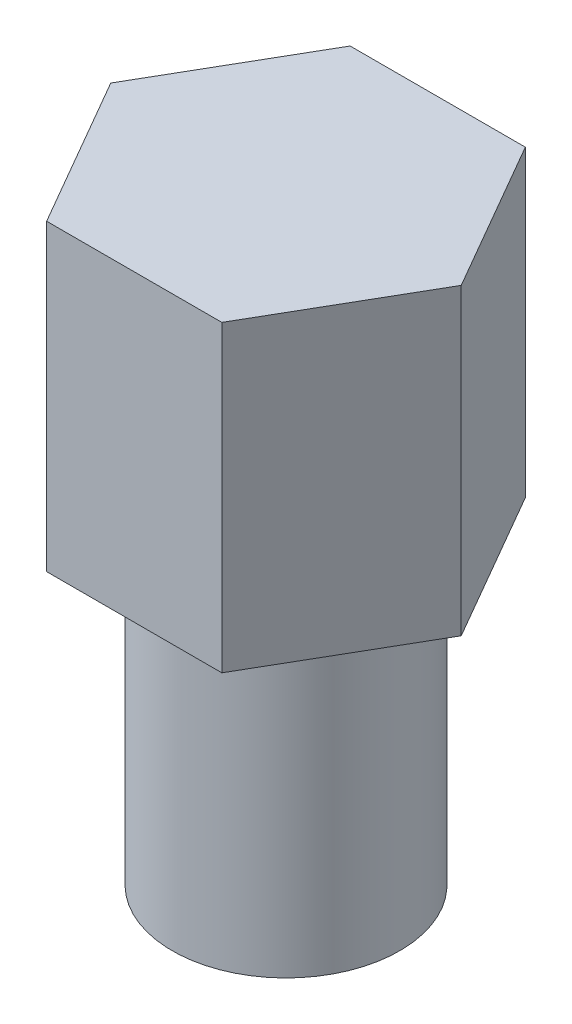
ISO-10303-21;
HEADER;
FILE_DESCRIPTION(('STEP AP214'),'2;1');
FILE_NAME('part.step','',(''),(''),'','','');
FILE_SCHEMA(('AUTOMOTIVE_DESIGN { 1 0 10303 214 1 1 1 1 }'));
ENDSEC;
DATA;
#1=APPLICATION_CONTEXT('core data for automotive mechanical design processes');
#2=APPLICATION_PROTOCOL_DEFINITION('international standard','automotive_design',2000,#1);
#3=PRODUCT_CONTEXT('',#1,'mechanical');
#4=PRODUCT('Part','Part','',(#3));
#5=PRODUCT_RELATED_PRODUCT_CATEGORY('part','',(#4));
#6=PRODUCT_DEFINITION_FORMATION('','',#4);
#7=PRODUCT_DEFINITION_CONTEXT('part definition',#1,'design');
#8=PRODUCT_DEFINITION('design','',#6,#7);
#9=PRODUCT_DEFINITION_SHAPE('','',#8);
#10=(LENGTH_UNIT() NAMED_UNIT(*) SI_UNIT(.MILLI.,.METRE.));
#11=(NAMED_UNIT(*) PLANE_ANGLE_UNIT() SI_UNIT($,.RADIAN.));
#12=(NAMED_UNIT(*) SI_UNIT($,.STERADIAN.) SOLID_ANGLE_UNIT());
#13=UNCERTAINTY_MEASURE_WITH_UNIT(LENGTH_MEASURE(1.E-05),#10,'distance_accuracy_value','');
#14=(GEOMETRIC_REPRESENTATION_CONTEXT(3) GLOBAL_UNCERTAINTY_ASSIGNED_CONTEXT((#13)) GLOBAL_UNIT_ASSIGNED_CONTEXT((#10,
#11,#12)) REPRESENTATION_CONTEXT('',''));
#15=CARTESIAN_POINT('',(0.,0.,0.));
#16=DIRECTION('',(0.,0.,1.));
#17=DIRECTION('',(1.,0.,0.));
#18=AXIS2_PLACEMENT_3D('',#15,#16,#17);
#19=CARTESIAN_POINT('',(7.33234841870825,0.,0.));
#20=DIRECTION('',(0.,-1.,0.));
#21=DIRECTION('',(0.,0.,-1.));
#22=AXIS2_PLACEMENT_3D('',#19,#20,#21);
#23=PLANE('',#22);
#24=DIRECTION('',(-0.5,0.,-0.866025403784438));
#25=VECTOR('',#24,1.);
#26=CARTESIAN_POINT('',(7.33234841870825,0.,0.));
#27=LINE('',#26,#25);
#28=CARTESIAN_POINT('',(7.33234841870825,0.,0.));
#29=VERTEX_POINT('',#28);
#30=CARTESIAN_POINT('',(3.66617420935412,0.,-6.35));
#31=VERTEX_POINT('',#30);
#32=EDGE_CURVE('E87',#29,#31,#27,.T.);
#33=ORIENTED_EDGE('',*,*,#32,.F.);
#34=DIRECTION('',(0.5,0.,-0.866025403784438));
#35=VECTOR('',#34,1.);
#36=CARTESIAN_POINT('',(3.66617420935412,0.,6.35));
#37=LINE('',#36,#35);
#38=CARTESIAN_POINT('',(3.66617420935412,0.,6.35));
#39=VERTEX_POINT('',#38);
#40=EDGE_CURVE('E113',#39,#29,#37,.T.);
#41=ORIENTED_EDGE('',*,*,#40,.F.);
#42=DIRECTION('',(1.,0.,0.));
#43=VECTOR('',#42,1.);
#44=CARTESIAN_POINT('',(-3.66617420935412,0.,6.35));
#45=LINE('',#44,#43);
#46=CARTESIAN_POINT('',(-3.66617420935412,0.,6.35));
#47=VERTEX_POINT('',#46);
#48=EDGE_CURVE('E111',#47,#39,#45,.T.);
#49=ORIENTED_EDGE('',*,*,#48,.F.);
#50=DIRECTION('',(0.5,0.,0.866025403784439));
#51=VECTOR('',#50,1.);
#52=CARTESIAN_POINT('',(-7.33234841870825,0.,0.));
#53=LINE('',#52,#51);
#54=CARTESIAN_POINT('',(-7.33234841870825,0.,0.));
#55=VERTEX_POINT('',#54);
#56=EDGE_CURVE('E109',#55,#47,#53,.T.);
#57=ORIENTED_EDGE('',*,*,#56,.F.);
#58=DIRECTION('',(-0.5,0.,0.866025403784439));
#59=VECTOR('',#58,1.);
#60=CARTESIAN_POINT('',(-3.66617420935413,0.,-6.35));
#61=LINE('',#60,#59);
#62=CARTESIAN_POINT('',(-3.66617420935413,0.,-6.35));
#63=VERTEX_POINT('',#62);
#64=EDGE_CURVE('E89',#63,#55,#61,.T.);
#65=ORIENTED_EDGE('',*,*,#64,.F.);
#66=DIRECTION('',(-1.,0.,0.));
#67=VECTOR('',#66,1.);
#68=CARTESIAN_POINT('',(3.66617420935412,0.,-6.35));
#69=LINE('',#68,#67);
#70=EDGE_CURVE('E83',#31,#63,#69,.T.);
#71=ORIENTED_EDGE('',*,*,#70,.F.);
#72=EDGE_LOOP('',(#33,#41,#49,#57,#65,#71));
#73=FACE_BOUND('',#72,.T.);
#74=CARTESIAN_POINT('',(0.,0.,0.));
#75=DIRECTION('',(0.,-1.,0.));
#76=DIRECTION('',(0.,0.,-1.));
#77=AXIS2_PLACEMENT_3D('',#74,#75,#76);
#78=CIRCLE('',#77,4.7625);
#79=CARTESIAN_POINT('',(0.,0.,-4.7625));
#80=VERTEX_POINT('',#79);
#81=EDGE_CURVE('E104',#80,#80,#78,.T.);
#82=ORIENTED_EDGE('',*,*,#81,.F.);
#83=EDGE_LOOP('',(#82));
#84=FACE_BOUND('',#83,.T.);
#85=ADVANCED_FACE('F30',(#73,#84),#23,.T.);
#86=CARTESIAN_POINT('',(7.33234841870825,12.7,0.));
#87=DIRECTION('',(-0.866025403784438,0.,0.5));
#88=DIRECTION('',(0.5,0.,0.866025403784439));
#89=AXIS2_PLACEMENT_3D('',#86,#87,#88);
#90=PLANE('',#89);
#91=ORIENTED_EDGE('',*,*,#32,.T.);
#92=DIRECTION('',(0.,-1.,0.));
#93=VECTOR('',#92,1.);
#94=CARTESIAN_POINT('',(3.66617420935412,12.7,-6.35));
#95=LINE('',#94,#93);
#96=CARTESIAN_POINT('',(3.66617420935412,12.7,-6.35));
#97=VERTEX_POINT('',#96);
#98=EDGE_CURVE('E11',#97,#31,#95,.T.);
#99=ORIENTED_EDGE('',*,*,#98,.F.);
#100=DIRECTION('',(-0.5,0.,-0.866025403784438));
#101=VECTOR('',#100,1.);
#102=CARTESIAN_POINT('',(7.33234841870825,12.7,0.));
#103=LINE('',#102,#101);
#104=CARTESIAN_POINT('',(7.33234841870825,12.7,0.));
#105=VERTEX_POINT('',#104);
#106=EDGE_CURVE('E115',#105,#97,#103,.T.);
#107=ORIENTED_EDGE('',*,*,#106,.F.);
#108=DIRECTION('',(0.,-1.,0.));
#109=VECTOR('',#108,1.);
#110=CARTESIAN_POINT('',(7.33234841870825,12.7,0.));
#111=LINE('',#110,#109);
#112=EDGE_CURVE('E100',#105,#29,#111,.T.);
#113=ORIENTED_EDGE('',*,*,#112,.T.);
#114=EDGE_LOOP('',(#91,#99,#107,#113));
#115=FACE_BOUND('',#114,.T.);
#116=ADVANCED_FACE('F32',(#115),#90,.F.);
#117=CARTESIAN_POINT('',(3.66617420935412,12.7,-6.35));
#118=DIRECTION('',(0.,0.,1.));
#119=DIRECTION('',(1.,0.,0.));
#120=AXIS2_PLACEMENT_3D('',#117,#118,#119);
#121=PLANE('',#120);
#122=ORIENTED_EDGE('',*,*,#70,.T.);
#123=DIRECTION('',(0.,-1.,0.));
#124=VECTOR('',#123,1.);
#125=CARTESIAN_POINT('',(-3.66617420935413,12.7,-6.35));
#126=LINE('',#125,#124);
#127=CARTESIAN_POINT('',(-3.66617420935413,12.7,-6.35));
#128=VERTEX_POINT('',#127);
#129=EDGE_CURVE('E38',#128,#63,#126,.T.);
#130=ORIENTED_EDGE('',*,*,#129,.F.);
#131=DIRECTION('',(-1.,0.,0.));
#132=VECTOR('',#131,1.);
#133=CARTESIAN_POINT('',(3.66617420935412,12.7,-6.35));
#134=LINE('',#133,#132);
#135=EDGE_CURVE('E96',#97,#128,#134,.T.);
#136=ORIENTED_EDGE('',*,*,#135,.F.);
#137=ORIENTED_EDGE('',*,*,#98,.T.);
#138=EDGE_LOOP('',(#122,#130,#136,#137));
#139=FACE_BOUND('',#138,.T.);
#140=ADVANCED_FACE('F95',(#139),#121,.F.);
#141=CARTESIAN_POINT('',(-3.66617420935413,12.7,-6.35));
#142=DIRECTION('',(0.866025403784439,0.,0.5));
#143=DIRECTION('',(0.5,0.,-0.866025403784439));
#144=AXIS2_PLACEMENT_3D('',#141,#142,#143);
#145=PLANE('',#144);
#146=ORIENTED_EDGE('',*,*,#64,.T.);
#147=DIRECTION('',(0.,-1.,0.));
#148=VECTOR('',#147,1.);
#149=CARTESIAN_POINT('',(-7.33234841870825,12.7,0.));
#150=LINE('',#149,#148);
#151=CARTESIAN_POINT('',(-7.33234841870825,12.7,0.));
#152=VERTEX_POINT('',#151);
#153=EDGE_CURVE('E131',#152,#55,#150,.T.);
#154=ORIENTED_EDGE('',*,*,#153,.F.);
#155=DIRECTION('',(-0.5,0.,0.866025403784439));
#156=VECTOR('',#155,1.);
#157=CARTESIAN_POINT('',(-3.66617420935413,12.7,-6.35));
#158=LINE('',#157,#156);
#159=EDGE_CURVE('E118',#128,#152,#158,.T.);
#160=ORIENTED_EDGE('',*,*,#159,.F.);
#161=ORIENTED_EDGE('',*,*,#129,.T.);
#162=EDGE_LOOP('',(#146,#154,#160,#161));
#163=FACE_BOUND('',#162,.T.);
#164=ADVANCED_FACE('F135',(#163),#145,.F.);
#165=CARTESIAN_POINT('',(-7.33234841870825,12.7,0.));
#166=DIRECTION('',(0.866025403784438,0.,-0.5));
#167=DIRECTION('',(-0.5,0.,-0.866025403784439));
#168=AXIS2_PLACEMENT_3D('',#165,#166,#167);
#169=PLANE('',#168);
#170=ORIENTED_EDGE('',*,*,#56,.T.);
#171=DIRECTION('',(0.,-1.,0.));
#172=VECTOR('',#171,1.);
#173=CARTESIAN_POINT('',(-3.66617420935412,12.7,6.35));
#174=LINE('',#173,#172);
#175=CARTESIAN_POINT('',(-3.66617420935412,12.7,6.35));
#176=VERTEX_POINT('',#175);
#177=EDGE_CURVE('E128',#176,#47,#174,.T.);
#178=ORIENTED_EDGE('',*,*,#177,.F.);
#179=DIRECTION('',(0.5,0.,0.866025403784439));
#180=VECTOR('',#179,1.);
#181=CARTESIAN_POINT('',(-7.33234841870825,12.7,0.));
#182=LINE('',#181,#180);
#183=EDGE_CURVE('E120',#152,#176,#182,.T.);
#184=ORIENTED_EDGE('',*,*,#183,.F.);
#185=ORIENTED_EDGE('',*,*,#153,.T.);
#186=EDGE_LOOP('',(#170,#178,#184,#185));
#187=FACE_BOUND('',#186,.T.);
#188=ADVANCED_FACE('F141',(#187),#169,.F.);
#189=CARTESIAN_POINT('',(-3.66617420935412,12.7,6.35));
#190=DIRECTION('',(0.,0.,-1.));
#191=DIRECTION('',(-1.,0.,0.));
#192=AXIS2_PLACEMENT_3D('',#189,#190,#191);
#193=PLANE('',#192);
#194=ORIENTED_EDGE('',*,*,#48,.T.);
#195=DIRECTION('',(0.,-1.,0.));
#196=VECTOR('',#195,1.);
#197=CARTESIAN_POINT('',(3.66617420935412,12.7,6.35));
#198=LINE('',#197,#196);
#199=CARTESIAN_POINT('',(3.66617420935412,12.7,6.35));
#200=VERTEX_POINT('',#199);
#201=EDGE_CURVE('E125',#200,#39,#198,.T.);
#202=ORIENTED_EDGE('',*,*,#201,.F.);
#203=DIRECTION('',(1.,0.,0.));
#204=VECTOR('',#203,1.);
#205=CARTESIAN_POINT('',(-3.66617420935412,12.7,6.35));
#206=LINE('',#205,#204);
#207=EDGE_CURVE('E50',#176,#200,#206,.T.);
#208=ORIENTED_EDGE('',*,*,#207,.F.);
#209=ORIENTED_EDGE('',*,*,#177,.T.);
#210=EDGE_LOOP('',(#194,#202,#208,#209));
#211=FACE_BOUND('',#210,.T.);
#212=ADVANCED_FACE('F144',(#211),#193,.F.);
#213=CARTESIAN_POINT('',(3.66617420935412,12.7,6.35));
#214=DIRECTION('',(-0.866025403784438,0.,-0.5));
#215=DIRECTION('',(-0.5,0.,0.866025403784438));
#216=AXIS2_PLACEMENT_3D('',#213,#214,#215);
#217=PLANE('',#216);
#218=ORIENTED_EDGE('',*,*,#40,.T.);
#219=ORIENTED_EDGE('',*,*,#112,.F.);
#220=DIRECTION('',(0.5,0.,-0.866025403784438));
#221=VECTOR('',#220,1.);
#222=CARTESIAN_POINT('',(3.66617420935412,12.7,6.35));
#223=LINE('',#222,#221);
#224=EDGE_CURVE('E45',#200,#105,#223,.T.);
#225=ORIENTED_EDGE('',*,*,#224,.F.);
#226=ORIENTED_EDGE('',*,*,#201,.T.);
#227=EDGE_LOOP('',(#218,#219,#225,#226));
#228=FACE_BOUND('',#227,.T.);
#229=ADVANCED_FACE('F146',(#228),#217,.F.);
#230=CARTESIAN_POINT('',(7.33234841870825,12.7,0.));
#231=DIRECTION('',(0.,-1.,0.));
#232=DIRECTION('',(0.,0.,-1.));
#233=AXIS2_PLACEMENT_3D('',#230,#231,#232);
#234=PLANE('',#233);
#235=ORIENTED_EDGE('',*,*,#106,.T.);
#236=ORIENTED_EDGE('',*,*,#135,.T.);
#237=ORIENTED_EDGE('',*,*,#159,.T.);
#238=ORIENTED_EDGE('',*,*,#183,.T.);
#239=ORIENTED_EDGE('',*,*,#207,.T.);
#240=ORIENTED_EDGE('',*,*,#224,.T.);
#241=EDGE_LOOP('',(#235,#236,#237,#238,#239,#240));
#242=FACE_BOUND('',#241,.T.);
#243=ADVANCED_FACE('F138',(#242),#234,.F.);
#244=CARTESIAN_POINT('',(0.,-12.7,0.));
#245=DIRECTION('',(0.,1.,0.));
#246=DIRECTION('',(0.,0.,1.));
#247=AXIS2_PLACEMENT_3D('',#244,#245,#246);
#248=CYLINDRICAL_SURFACE('',#247,4.7625);
#249=CARTESIAN_POINT('',(0.,-12.7,0.));
#250=DIRECTION('',(0.,-1.,0.));
#251=DIRECTION('',(0.,0.,-1.));
#252=AXIS2_PLACEMENT_3D('',#249,#250,#251);
#253=CIRCLE('',#252,4.7625);
#254=CARTESIAN_POINT('',(0.,-12.7,-4.7625));
#255=VERTEX_POINT('',#254);
#256=EDGE_CURVE('E101',#255,#255,#253,.T.);
#257=ORIENTED_EDGE('',*,*,#256,.F.);
#258=EDGE_LOOP('',(#257));
#259=FACE_BOUND('',#258,.T.);
#260=ORIENTED_EDGE('',*,*,#81,.T.);
#261=EDGE_LOOP('',(#260));
#262=FACE_BOUND('',#261,.T.);
#263=ADVANCED_FACE('F153',(#259,#262),#248,.T.);
#264=CARTESIAN_POINT('',(0.,-12.7,0.));
#265=DIRECTION('',(0.,-1.,0.));
#266=DIRECTION('',(0.,0.,-1.));
#267=AXIS2_PLACEMENT_3D('',#264,#265,#266);
#268=PLANE('',#267);
#269=ORIENTED_EDGE('',*,*,#256,.T.);
#270=EDGE_LOOP('',(#269));
#271=FACE_BOUND('',#270,.T.);
#272=ADVANCED_FACE('F164',(#271),#268,.T.);
#273=CLOSED_SHELL('',(#85,#116,#140,#164,#188,#212,#229,#243,#263,#272));
#274=MANIFOLD_SOLID_BREP('B2',#273);
#275=ADVANCED_BREP_SHAPE_REPRESENTATION('',(#18,#274),#14);
#276=SHAPE_DEFINITION_REPRESENTATION(#9,#275);
ENDSEC;
END-ISO-10303-21;
